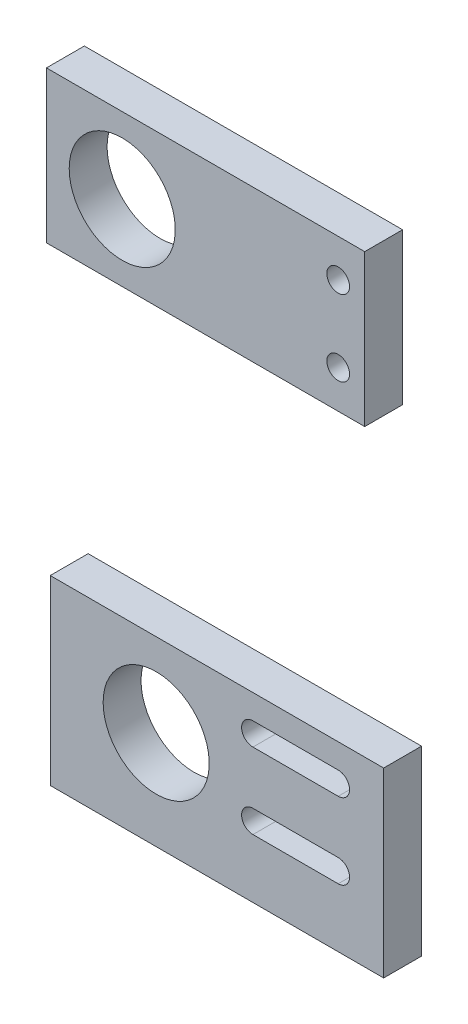
ISO-10303-21;
HEADER;
FILE_DESCRIPTION(('STEP AP214'),'2;1');
FILE_NAME('part.step','',(''),(''),'','','');
FILE_SCHEMA(('AUTOMOTIVE_DESIGN { 1 0 10303 214 1 1 1 1 }'));
ENDSEC;
DATA;
#1=APPLICATION_CONTEXT('core data for automotive mechanical design processes');
#2=APPLICATION_PROTOCOL_DEFINITION('international standard','automotive_design',2000,#1);
#3=PRODUCT_CONTEXT('',#1,'mechanical');
#4=PRODUCT('Part','Part','',(#3));
#5=PRODUCT_RELATED_PRODUCT_CATEGORY('part','',(#4));
#6=PRODUCT_DEFINITION_FORMATION('','',#4);
#7=PRODUCT_DEFINITION_CONTEXT('part definition',#1,'design');
#8=PRODUCT_DEFINITION('design','',#6,#7);
#9=PRODUCT_DEFINITION_SHAPE('','',#8);
#10=(LENGTH_UNIT() NAMED_UNIT(*) SI_UNIT(.MILLI.,.METRE.));
#11=(NAMED_UNIT(*) PLANE_ANGLE_UNIT() SI_UNIT($,.RADIAN.));
#12=(NAMED_UNIT(*) SI_UNIT($,.STERADIAN.) SOLID_ANGLE_UNIT());
#13=UNCERTAINTY_MEASURE_WITH_UNIT(LENGTH_MEASURE(1.E-05),#10,'distance_accuracy_value','');
#14=(GEOMETRIC_REPRESENTATION_CONTEXT(3) GLOBAL_UNCERTAINTY_ASSIGNED_CONTEXT((#13)) GLOBAL_UNIT_ASSIGNED_CONTEXT((#10,
#11,#12)) REPRESENTATION_CONTEXT('',''));
#15=CARTESIAN_POINT('',(0.,0.,0.));
#16=DIRECTION('',(0.,0.,1.));
#17=DIRECTION('',(1.,0.,0.));
#18=AXIS2_PLACEMENT_3D('',#15,#16,#17);
#19=CARTESIAN_POINT('',(3.5,0.,0.));
#20=DIRECTION('',(-1.,0.,0.));
#21=DIRECTION('',(0.,0.,1.));
#22=AXIS2_PLACEMENT_3D('',#19,#20,#21);
#23=PLANE('',#22);
#24=DIRECTION('',(0.,0.,-1.));
#25=VECTOR('',#24,1.);
#26=CARTESIAN_POINT('',(3.5,-10.,32.08));
#27=LINE('',#26,#25);
#28=CARTESIAN_POINT('',(3.5,-10.,32.08));
#29=VERTEX_POINT('',#28);
#30=CARTESIAN_POINT('',(3.5,-10.,27.08));
#31=VERTEX_POINT('',#30);
#32=EDGE_CURVE('E101',#29,#31,#27,.T.);
#33=ORIENTED_EDGE('',*,*,#32,.T.);
#34=DIRECTION('',(0.,1.,0.));
#35=VECTOR('',#34,1.);
#36=CARTESIAN_POINT('',(3.5,0.,27.08));
#37=LINE('',#36,#35);
#38=CARTESIAN_POINT('',(3.5,10.,27.08));
#39=VERTEX_POINT('',#38);
#40=EDGE_CURVE('E59',#31,#39,#37,.T.);
#41=ORIENTED_EDGE('',*,*,#40,.T.);
#42=DIRECTION('',(0.,0.,1.));
#43=VECTOR('',#42,1.);
#44=CARTESIAN_POINT('',(3.5,10.,32.08));
#45=LINE('',#44,#43);
#46=CARTESIAN_POINT('',(3.5,10.,32.08));
#47=VERTEX_POINT('',#46);
#48=EDGE_CURVE('E107',#39,#47,#45,.T.);
#49=ORIENTED_EDGE('',*,*,#48,.T.);
#50=DIRECTION('',(0.,-1.,0.));
#51=VECTOR('',#50,1.);
#52=CARTESIAN_POINT('',(3.5,10.,32.08));
#53=LINE('',#52,#51);
#54=EDGE_CURVE('E119',#47,#29,#53,.T.);
#55=ORIENTED_EDGE('',*,*,#54,.T.);
#56=EDGE_LOOP('',(#33,#41,#49,#55));
#57=FACE_BOUND('',#56,.T.);
#58=ADVANCED_FACE('F56',(#57),#23,.F.);
#59=CARTESIAN_POINT('',(-3.5,-10.,32.08));
#60=DIRECTION('',(0.,-1.,0.));
#61=DIRECTION('',(0.,0.,-1.));
#62=AXIS2_PLACEMENT_3D('',#59,#60,#61);
#63=PLANE('',#62);
#64=DIRECTION('',(1.,0.,0.));
#65=VECTOR('',#64,1.);
#66=CARTESIAN_POINT('',(-3.5,-10.,32.08));
#67=LINE('',#66,#65);
#68=CARTESIAN_POINT('',(-38.5,-10.,32.08));
#69=VERTEX_POINT('',#68);
#70=EDGE_CURVE('E96',#69,#29,#67,.T.);
#71=ORIENTED_EDGE('',*,*,#70,.F.);
#72=DIRECTION('',(0.,0.,1.));
#73=VECTOR('',#72,1.);
#74=CARTESIAN_POINT('',(-38.5,-10.,32.08));
#75=LINE('',#74,#73);
#76=CARTESIAN_POINT('',(-38.5,-10.,27.08));
#77=VERTEX_POINT('',#76);
#78=EDGE_CURVE('E99',#77,#69,#75,.T.);
#79=ORIENTED_EDGE('',*,*,#78,.F.);
#80=DIRECTION('',(1.,0.,0.));
#81=VECTOR('',#80,1.);
#82=CARTESIAN_POINT('',(-3.5,-10.,27.08));
#83=LINE('',#82,#81);
#84=EDGE_CURVE('E128',#77,#31,#83,.T.);
#85=ORIENTED_EDGE('',*,*,#84,.T.);
#86=ORIENTED_EDGE('',*,*,#32,.F.);
#87=EDGE_LOOP('',(#71,#79,#85,#86));
#88=FACE_BOUND('',#87,.T.);
#89=ADVANCED_FACE('F98',(#88),#63,.T.);
#90=CARTESIAN_POINT('',(-3.5,10.,32.08));
#91=DIRECTION('',(0.,1.,0.));
#92=DIRECTION('',(0.,0.,1.));
#93=AXIS2_PLACEMENT_3D('',#90,#91,#92);
#94=PLANE('',#93);
#95=ORIENTED_EDGE('',*,*,#48,.F.);
#96=DIRECTION('',(1.,0.,0.));
#97=VECTOR('',#96,1.);
#98=CARTESIAN_POINT('',(-38.5,10.,27.08));
#99=LINE('',#98,#97);
#100=CARTESIAN_POINT('',(-38.5,10.,27.08));
#101=VERTEX_POINT('',#100);
#102=EDGE_CURVE('E72',#101,#39,#99,.T.);
#103=ORIENTED_EDGE('',*,*,#102,.F.);
#104=DIRECTION('',(0.,0.,-1.));
#105=VECTOR('',#104,1.);
#106=CARTESIAN_POINT('',(-38.5,10.,32.08));
#107=LINE('',#106,#105);
#108=CARTESIAN_POINT('',(-38.5,10.,32.08));
#109=VERTEX_POINT('',#108);
#110=EDGE_CURVE('E120',#109,#101,#107,.T.);
#111=ORIENTED_EDGE('',*,*,#110,.F.);
#112=DIRECTION('',(1.,0.,0.));
#113=VECTOR('',#112,1.);
#114=CARTESIAN_POINT('',(-3.5,10.,32.08));
#115=LINE('',#114,#113);
#116=EDGE_CURVE('E106',#109,#47,#115,.T.);
#117=ORIENTED_EDGE('',*,*,#116,.T.);
#118=EDGE_LOOP('',(#95,#103,#111,#117));
#119=FACE_BOUND('',#118,.T.);
#120=ADVANCED_FACE('F146',(#119),#94,.T.);
#121=CARTESIAN_POINT('',(-3.5,10.,32.08));
#122=DIRECTION('',(0.,0.,1.));
#123=DIRECTION('',(1.,0.,0.));
#124=AXIS2_PLACEMENT_3D('',#121,#122,#123);
#125=PLANE('',#124);
#126=CARTESIAN_POINT('',(0.,5.,32.08));
#127=DIRECTION('',(0.,0.,1.));
#128=DIRECTION('',(1.,0.,0.));
#129=AXIS2_PLACEMENT_3D('',#126,#127,#128);
#130=CIRCLE('',#129,1.5);
#131=CARTESIAN_POINT('',(1.5,5.,32.08));
#132=VERTEX_POINT('',#131);
#133=EDGE_CURVE('E138',#132,#132,#130,.F.);
#134=ORIENTED_EDGE('',*,*,#133,.T.);
#135=EDGE_LOOP('',(#134));
#136=FACE_BOUND('',#135,.T.);
#137=CARTESIAN_POINT('',(0.,-5.,32.08));
#138=DIRECTION('',(0.,0.,1.));
#139=DIRECTION('',(1.,0.,0.));
#140=AXIS2_PLACEMENT_3D('',#137,#138,#139);
#141=CIRCLE('',#140,1.5);
#142=CARTESIAN_POINT('',(1.5,-5.,32.08));
#143=VERTEX_POINT('',#142);
#144=EDGE_CURVE('E135',#143,#143,#141,.F.);
#145=ORIENTED_EDGE('',*,*,#144,.T.);
#146=EDGE_LOOP('',(#145));
#147=FACE_BOUND('',#146,.T.);
#148=CARTESIAN_POINT('',(-28.5,0.,32.08));
#149=DIRECTION('',(0.,0.,-1.));
#150=DIRECTION('',(-1.,0.,0.));
#151=AXIS2_PLACEMENT_3D('',#148,#149,#150);
#152=CIRCLE('',#151,7.00000000000001);
#153=CARTESIAN_POINT('',(-35.5,0.,32.08));
#154=VERTEX_POINT('',#153);
#155=EDGE_CURVE('E134',#154,#154,#152,.T.);
#156=ORIENTED_EDGE('',*,*,#155,.T.);
#157=EDGE_LOOP('',(#156));
#158=FACE_BOUND('',#157,.T.);
#159=ORIENTED_EDGE('',*,*,#70,.T.);
#160=ORIENTED_EDGE('',*,*,#54,.F.);
#161=ORIENTED_EDGE('',*,*,#116,.F.);
#162=DIRECTION('',(0.,1.,0.));
#163=VECTOR('',#162,1.);
#164=CARTESIAN_POINT('',(-38.5,10.,32.08));
#165=LINE('',#164,#163);
#166=EDGE_CURVE('E113',#69,#109,#165,.T.);
#167=ORIENTED_EDGE('',*,*,#166,.F.);
#168=EDGE_LOOP('',(#159,#160,#161,#167));
#169=FACE_BOUND('',#168,.T.);
#170=ADVANCED_FACE('F116',(#136,#147,#158,#169),#125,.T.);
#171=CARTESIAN_POINT('',(0.,5.,39.58));
#172=DIRECTION('',(0.,0.,-1.));
#173=DIRECTION('',(-1.,0.,0.));
#174=AXIS2_PLACEMENT_3D('',#171,#172,#173);
#175=CYLINDRICAL_SURFACE('',#174,1.5);
#176=CARTESIAN_POINT('',(0.,5.,27.08));
#177=DIRECTION('',(0.,0.,1.));
#178=DIRECTION('',(1.,0.,0.));
#179=AXIS2_PLACEMENT_3D('',#176,#177,#178);
#180=CIRCLE('',#179,1.5);
#181=CARTESIAN_POINT('',(1.5,5.,27.08));
#182=VERTEX_POINT('',#181);
#183=EDGE_CURVE('E12',#182,#182,#180,.T.);
#184=ORIENTED_EDGE('',*,*,#183,.F.);
#185=EDGE_LOOP('',(#184));
#186=FACE_BOUND('',#185,.T.);
#187=ORIENTED_EDGE('',*,*,#133,.F.);
#188=EDGE_LOOP('',(#187));
#189=FACE_BOUND('',#188,.T.);
#190=ADVANCED_FACE('F174',(#186,#189),#175,.F.);
#191=CARTESIAN_POINT('',(0.,-5.,39.58));
#192=DIRECTION('',(0.,0.,-1.));
#193=DIRECTION('',(-1.,0.,0.));
#194=AXIS2_PLACEMENT_3D('',#191,#192,#193);
#195=CYLINDRICAL_SURFACE('',#194,1.5);
#196=CARTESIAN_POINT('',(0.,-5.,27.08));
#197=DIRECTION('',(0.,0.,1.));
#198=DIRECTION('',(1.,0.,0.));
#199=AXIS2_PLACEMENT_3D('',#196,#197,#198);
#200=CIRCLE('',#199,1.5);
#201=CARTESIAN_POINT('',(1.5,-5.,27.08));
#202=VERTEX_POINT('',#201);
#203=EDGE_CURVE('E64',#202,#202,#200,.T.);
#204=ORIENTED_EDGE('',*,*,#203,.F.);
#205=EDGE_LOOP('',(#204));
#206=FACE_BOUND('',#205,.T.);
#207=ORIENTED_EDGE('',*,*,#144,.F.);
#208=EDGE_LOOP('',(#207));
#209=FACE_BOUND('',#208,.T.);
#210=ADVANCED_FACE('F158',(#206,#209),#195,.F.);
#211=CARTESIAN_POINT('',(-28.5,0.,32.08));
#212=DIRECTION('',(0.,0.,-1.));
#213=DIRECTION('',(-1.,0.,0.));
#214=AXIS2_PLACEMENT_3D('',#211,#212,#213);
#215=CYLINDRICAL_SURFACE('',#214,7.00000000000001);
#216=ORIENTED_EDGE('',*,*,#155,.F.);
#217=EDGE_LOOP('',(#216));
#218=FACE_BOUND('',#217,.T.);
#219=CARTESIAN_POINT('',(-28.5,0.,27.08));
#220=DIRECTION('',(0.,0.,1.));
#221=DIRECTION('',(0.,-1.,0.));
#222=AXIS2_PLACEMENT_3D('',#219,#220,#221);
#223=CIRCLE('',#222,7.00000000000001);
#224=CARTESIAN_POINT('',(-28.5,-7.00000000000001,27.08));
#225=VERTEX_POINT('',#224);
#226=EDGE_CURVE('E131',#225,#225,#223,.T.);
#227=ORIENTED_EDGE('',*,*,#226,.F.);
#228=EDGE_LOOP('',(#227));
#229=FACE_BOUND('',#228,.T.);
#230=ADVANCED_FACE('F155',(#218,#229),#215,.F.);
#231=CARTESIAN_POINT('',(-38.5,0.,0.));
#232=DIRECTION('',(1.,0.,0.));
#233=DIRECTION('',(0.,0.,-1.));
#234=AXIS2_PLACEMENT_3D('',#231,#232,#233);
#235=PLANE('',#234);
#236=ORIENTED_EDGE('',*,*,#166,.T.);
#237=ORIENTED_EDGE('',*,*,#110,.T.);
#238=DIRECTION('',(0.,-1.,0.));
#239=VECTOR('',#238,1.);
#240=CARTESIAN_POINT('',(-38.5,10.,27.08));
#241=LINE('',#240,#239);
#242=EDGE_CURVE('E114',#101,#77,#241,.T.);
#243=ORIENTED_EDGE('',*,*,#242,.T.);
#244=ORIENTED_EDGE('',*,*,#78,.T.);
#245=EDGE_LOOP('',(#236,#237,#243,#244));
#246=FACE_BOUND('',#245,.T.);
#247=ADVANCED_FACE('F112',(#246),#235,.F.);
#248=CARTESIAN_POINT('',(-38.5,10.,27.08));
#249=DIRECTION('',(0.,0.,1.));
#250=DIRECTION('',(0.,-1.,0.));
#251=AXIS2_PLACEMENT_3D('',#248,#249,#250);
#252=PLANE('',#251);
#253=ORIENTED_EDGE('',*,*,#226,.T.);
#254=EDGE_LOOP('',(#253));
#255=FACE_BOUND('',#254,.T.);
#256=ORIENTED_EDGE('',*,*,#102,.T.);
#257=ORIENTED_EDGE('',*,*,#40,.F.);
#258=ORIENTED_EDGE('',*,*,#84,.F.);
#259=ORIENTED_EDGE('',*,*,#242,.F.);
#260=EDGE_LOOP('',(#256,#257,#258,#259));
#261=FACE_BOUND('',#260,.T.);
#262=ORIENTED_EDGE('',*,*,#183,.T.);
#263=EDGE_LOOP('',(#262));
#264=FACE_BOUND('',#263,.T.);
#265=ORIENTED_EDGE('',*,*,#203,.T.);
#266=EDGE_LOOP('',(#265));
#267=FACE_BOUND('',#266,.T.);
#268=ADVANCED_FACE('F148',(#255,#261,#264,#267),#252,.F.);
#269=CLOSED_SHELL('',(#58,#89,#120,#170,#190,#210,#230,#247,#268));
#270=MANIFOLD_SOLID_BREP('B2_NOT_SHOWN',#269);
#271=CARTESIAN_POINT('',(0.,-52.5,39.58));
#272=DIRECTION('',(0.,0.,-1.));
#273=DIRECTION('',(-1.,0.,0.));
#274=AXIS2_PLACEMENT_3D('',#271,#272,#273);
#275=CYLINDRICAL_SURFACE('',#274,1.5);
#276=CARTESIAN_POINT('',(0.,-52.5,32.08));
#277=DIRECTION('',(0.,0.,1.));
#278=DIRECTION('',(1.,0.,0.));
#279=AXIS2_PLACEMENT_3D('',#276,#277,#278);
#280=CIRCLE('',#279,1.5);
#281=CARTESIAN_POINT('',(0.,-51.,32.08));
#282=VERTEX_POINT('',#281);
#283=CARTESIAN_POINT('',(0.,-54.,32.08));
#284=VERTEX_POINT('',#283);
#285=EDGE_CURVE('E488',#282,#284,#280,.F.);
#286=ORIENTED_EDGE('',*,*,#285,.F.);
#287=DIRECTION('',(0.,0.,-1.));
#288=VECTOR('',#287,1.);
#289=CARTESIAN_POINT('',(0.,-51.,39.58));
#290=LINE('',#289,#288);
#291=CARTESIAN_POINT('',(0.,-51.,27.08));
#292=VERTEX_POINT('',#291);
#293=EDGE_CURVE('E471',#292,#282,#290,.F.);
#294=ORIENTED_EDGE('',*,*,#293,.F.);
#295=CARTESIAN_POINT('',(0.,-52.5,27.08));
#296=DIRECTION('',(0.,0.,1.));
#297=DIRECTION('',(1.,0.,0.));
#298=AXIS2_PLACEMENT_3D('',#295,#296,#297);
#299=CIRCLE('',#298,1.5);
#300=CARTESIAN_POINT('',(0.,-54.,27.08));
#301=VERTEX_POINT('',#300);
#302=EDGE_CURVE('E312',#301,#292,#299,.T.);
#303=ORIENTED_EDGE('',*,*,#302,.F.);
#304=DIRECTION('',(0.,0.,-1.));
#305=VECTOR('',#304,1.);
#306=CARTESIAN_POINT('',(0.,-54.,39.58));
#307=LINE('',#306,#305);
#308=EDGE_CURVE('E474',#301,#284,#307,.F.);
#309=ORIENTED_EDGE('',*,*,#308,.T.);
#310=EDGE_LOOP('',(#286,#294,#303,#309));
#311=FACE_BOUND('',#310,.T.);
#312=ADVANCED_FACE('F308',(#311),#275,.F.);
#313=CARTESIAN_POINT('',(0.,-62.5,39.58));
#314=DIRECTION('',(0.,0.,-1.));
#315=DIRECTION('',(-1.,0.,0.));
#316=AXIS2_PLACEMENT_3D('',#313,#314,#315);
#317=CYLINDRICAL_SURFACE('',#316,1.5);
#318=CARTESIAN_POINT('',(0.,-62.5,32.08));
#319=DIRECTION('',(0.,0.,1.));
#320=DIRECTION('',(1.,0.,0.));
#321=AXIS2_PLACEMENT_3D('',#318,#319,#320);
#322=CIRCLE('',#321,1.5);
#323=CARTESIAN_POINT('',(0.,-61.,32.08));
#324=VERTEX_POINT('',#323);
#325=CARTESIAN_POINT('',(0.,-64.,32.08));
#326=VERTEX_POINT('',#325);
#327=EDGE_CURVE('E493',#324,#326,#322,.F.);
#328=ORIENTED_EDGE('',*,*,#327,.F.);
#329=DIRECTION('',(0.,0.,-1.));
#330=VECTOR('',#329,1.);
#331=CARTESIAN_POINT('',(0.,-61.,39.58));
#332=LINE('',#331,#330);
#333=CARTESIAN_POINT('',(0.,-61.,27.08));
#334=VERTEX_POINT('',#333);
#335=EDGE_CURVE('E439',#334,#324,#332,.F.);
#336=ORIENTED_EDGE('',*,*,#335,.F.);
#337=CARTESIAN_POINT('',(0.,-62.5,27.08));
#338=DIRECTION('',(0.,0.,1.));
#339=DIRECTION('',(1.,0.,0.));
#340=AXIS2_PLACEMENT_3D('',#337,#338,#339);
#341=CIRCLE('',#340,1.5);
#342=CARTESIAN_POINT('',(0.,-64.,27.08));
#343=VERTEX_POINT('',#342);
#344=EDGE_CURVE('E501',#343,#334,#341,.T.);
#345=ORIENTED_EDGE('',*,*,#344,.F.);
#346=DIRECTION('',(0.,0.,-1.));
#347=VECTOR('',#346,1.);
#348=CARTESIAN_POINT('',(0.,-64.,39.58));
#349=LINE('',#348,#347);
#350=EDGE_CURVE('E436',#343,#326,#349,.F.);
#351=ORIENTED_EDGE('',*,*,#350,.T.);
#352=EDGE_LOOP('',(#328,#336,#345,#351));
#353=FACE_BOUND('',#352,.T.);
#354=ADVANCED_FACE('F575',(#353),#317,.F.);
#355=CARTESIAN_POINT('',(0.,0.,27.08));
#356=DIRECTION('',(0.,0.,1.));
#357=DIRECTION('',(1.,0.,0.));
#358=AXIS2_PLACEMENT_3D('',#355,#356,#357);
#359=PLANE('',#358);
#360=DIRECTION('',(-1.,0.,0.));
#361=VECTOR('',#360,1.);
#362=CARTESIAN_POINT('',(3.5,-47.77,27.08));
#363=LINE('',#362,#361);
#364=CARTESIAN_POINT('',(6.,-47.77,27.08));
#365=VERTEX_POINT('',#364);
#366=CARTESIAN_POINT('',(-38.,-47.77,27.08));
#367=VERTEX_POINT('',#366);
#368=EDGE_CURVE('E510',#365,#367,#363,.T.);
#369=ORIENTED_EDGE('',*,*,#368,.F.);
#370=DIRECTION('',(0.,1.,0.));
#371=VECTOR('',#370,1.);
#372=CARTESIAN_POINT('',(6.,-71.77,27.08));
#373=LINE('',#372,#371);
#374=CARTESIAN_POINT('',(6.,-71.77,27.08));
#375=VERTEX_POINT('',#374);
#376=EDGE_CURVE('E422',#375,#365,#373,.T.);
#377=ORIENTED_EDGE('',*,*,#376,.F.);
#378=DIRECTION('',(1.,0.,0.));
#379=VECTOR('',#378,1.);
#380=CARTESIAN_POINT('',(3.5,-71.77,27.08));
#381=LINE('',#380,#379);
#382=CARTESIAN_POINT('',(-38.,-71.77,27.08));
#383=VERTEX_POINT('',#382);
#384=EDGE_CURVE('E417',#383,#375,#381,.T.);
#385=ORIENTED_EDGE('',*,*,#384,.F.);
#386=DIRECTION('',(0.,-1.,0.));
#387=VECTOR('',#386,1.);
#388=CARTESIAN_POINT('',(-38.,-71.77,27.08));
#389=LINE('',#388,#387);
#390=EDGE_CURVE('E506',#367,#383,#389,.T.);
#391=ORIENTED_EDGE('',*,*,#390,.F.);
#392=EDGE_LOOP('',(#369,#377,#385,#391));
#393=FACE_BOUND('',#392,.T.);
#394=ORIENTED_EDGE('',*,*,#344,.T.);
#395=DIRECTION('',(1.,0.,0.));
#396=VECTOR('',#395,1.);
#397=CARTESIAN_POINT('',(-11.25,-61.,27.08));
#398=LINE('',#397,#396);
#399=CARTESIAN_POINT('',(-11.25,-61.,27.08));
#400=VERTEX_POINT('',#399);
#401=EDGE_CURVE('E334',#400,#334,#398,.T.);
#402=ORIENTED_EDGE('',*,*,#401,.F.);
#403=CARTESIAN_POINT('',(-11.25,-62.5,27.08));
#404=DIRECTION('',(0.,0.,1.));
#405=DIRECTION('',(1.,0.,0.));
#406=AXIS2_PLACEMENT_3D('',#403,#404,#405);
#407=CIRCLE('',#406,1.5);
#408=CARTESIAN_POINT('',(-11.25,-64.,27.08));
#409=VERTEX_POINT('',#408);
#410=EDGE_CURVE('E489',#409,#400,#407,.F.);
#411=ORIENTED_EDGE('',*,*,#410,.F.);
#412=DIRECTION('',(-1.,0.,0.));
#413=VECTOR('',#412,1.);
#414=CARTESIAN_POINT('',(-11.25,-64.,27.08));
#415=LINE('',#414,#413);
#416=EDGE_CURVE('E457',#343,#409,#415,.T.);
#417=ORIENTED_EDGE('',*,*,#416,.F.);
#418=EDGE_LOOP('',(#394,#402,#411,#417));
#419=FACE_BOUND('',#418,.T.);
#420=ORIENTED_EDGE('',*,*,#302,.T.);
#421=DIRECTION('',(1.,0.,0.));
#422=VECTOR('',#421,1.);
#423=CARTESIAN_POINT('',(-11.25,-51.,27.08));
#424=LINE('',#423,#422);
#425=CARTESIAN_POINT('',(-11.25,-51.,27.08));
#426=VERTEX_POINT('',#425);
#427=EDGE_CURVE('E468',#426,#292,#424,.T.);
#428=ORIENTED_EDGE('',*,*,#427,.F.);
#429=CARTESIAN_POINT('',(-11.25,-52.5,27.08));
#430=DIRECTION('',(0.,0.,1.));
#431=DIRECTION('',(1.,0.,0.));
#432=AXIS2_PLACEMENT_3D('',#429,#430,#431);
#433=CIRCLE('',#432,1.5);
#434=CARTESIAN_POINT('',(-11.25,-54.,27.08));
#435=VERTEX_POINT('',#434);
#436=EDGE_CURVE('E318',#435,#426,#433,.F.);
#437=ORIENTED_EDGE('',*,*,#436,.F.);
#438=DIRECTION('',(-1.,0.,0.));
#439=VECTOR('',#438,1.);
#440=CARTESIAN_POINT('',(-11.25,-54.,27.08));
#441=LINE('',#440,#439);
#442=EDGE_CURVE('E435',#301,#435,#441,.T.);
#443=ORIENTED_EDGE('',*,*,#442,.F.);
#444=EDGE_LOOP('',(#420,#428,#437,#443));
#445=FACE_BOUND('',#444,.T.);
#446=CARTESIAN_POINT('',(-24.02,-58.77,27.08));
#447=DIRECTION('',(0.,0.,1.));
#448=DIRECTION('',(1.,0.,0.));
#449=AXIS2_PLACEMENT_3D('',#446,#447,#448);
#450=CIRCLE('',#449,7.);
#451=CARTESIAN_POINT('',(-17.02,-58.77,27.08));
#452=VERTEX_POINT('',#451);
#453=EDGE_CURVE('E512',#452,#452,#450,.T.);
#454=ORIENTED_EDGE('',*,*,#453,.T.);
#455=EDGE_LOOP('',(#454));
#456=FACE_BOUND('',#455,.T.);
#457=ADVANCED_FACE('F310',(#393,#419,#445,#456),#359,.F.);
#458=CARTESIAN_POINT('',(3.5,-47.77,32.08));
#459=DIRECTION('',(0.,-1.,0.));
#460=DIRECTION('',(1.,0.,0.));
#461=AXIS2_PLACEMENT_3D('',#458,#459,#460);
#462=PLANE('',#461);
#463=DIRECTION('',(-1.,0.,0.));
#464=VECTOR('',#463,1.);
#465=CARTESIAN_POINT('',(3.5,-47.77,32.08));
#466=LINE('',#465,#464);
#467=CARTESIAN_POINT('',(6.,-47.77,32.08));
#468=VERTEX_POINT('',#467);
#469=CARTESIAN_POINT('',(-38.,-47.77,32.08));
#470=VERTEX_POINT('',#469);
#471=EDGE_CURVE('E507',#468,#470,#466,.T.);
#472=ORIENTED_EDGE('',*,*,#471,.F.);
#473=DIRECTION('',(0.,0.,1.));
#474=VECTOR('',#473,1.);
#475=CARTESIAN_POINT('',(6.,-47.77,32.08));
#476=LINE('',#475,#474);
#477=EDGE_CURVE('E427',#365,#468,#476,.T.);
#478=ORIENTED_EDGE('',*,*,#477,.F.);
#479=ORIENTED_EDGE('',*,*,#368,.T.);
#480=DIRECTION('',(0.,0.,-1.));
#481=VECTOR('',#480,1.);
#482=CARTESIAN_POINT('',(-38.,-47.77,32.08));
#483=LINE('',#482,#481);
#484=EDGE_CURVE('E497',#470,#367,#483,.T.);
#485=ORIENTED_EDGE('',*,*,#484,.F.);
#486=EDGE_LOOP('',(#472,#478,#479,#485));
#487=FACE_BOUND('',#486,.T.);
#488=ADVANCED_FACE('F560',(#487),#462,.F.);
#489=CARTESIAN_POINT('',(-38.,-71.77,32.08));
#490=DIRECTION('',(1.,0.,0.));
#491=DIRECTION('',(0.,0.,-1.));
#492=AXIS2_PLACEMENT_3D('',#489,#490,#491);
#493=PLANE('',#492);
#494=ORIENTED_EDGE('',*,*,#390,.T.);
#495=DIRECTION('',(0.,0.,-1.));
#496=VECTOR('',#495,1.);
#497=CARTESIAN_POINT('',(-38.,-71.77,32.08));
#498=LINE('',#497,#496);
#499=CARTESIAN_POINT('',(-38.,-71.77,32.08));
#500=VERTEX_POINT('',#499);
#501=EDGE_CURVE('E411',#500,#383,#498,.T.);
#502=ORIENTED_EDGE('',*,*,#501,.F.);
#503=DIRECTION('',(0.,-1.,0.));
#504=VECTOR('',#503,1.);
#505=CARTESIAN_POINT('',(-38.,-71.77,32.08));
#506=LINE('',#505,#504);
#507=EDGE_CURVE('E406',#470,#500,#506,.T.);
#508=ORIENTED_EDGE('',*,*,#507,.F.);
#509=ORIENTED_EDGE('',*,*,#484,.T.);
#510=EDGE_LOOP('',(#494,#502,#508,#509));
#511=FACE_BOUND('',#510,.T.);
#512=ADVANCED_FACE('F571',(#511),#493,.F.);
#513=CARTESIAN_POINT('',(0.,0.,32.08));
#514=DIRECTION('',(0.,0.,1.));
#515=DIRECTION('',(1.,0.,0.));
#516=AXIS2_PLACEMENT_3D('',#513,#514,#515);
#517=PLANE('',#516);
#518=DIRECTION('',(-1.,0.,0.));
#519=VECTOR('',#518,1.);
#520=CARTESIAN_POINT('',(-11.25,-61.,32.08));
#521=LINE('',#520,#519);
#522=CARTESIAN_POINT('',(-11.25,-61.,32.08));
#523=VERTEX_POINT('',#522);
#524=EDGE_CURVE('E454',#324,#523,#521,.T.);
#525=ORIENTED_EDGE('',*,*,#524,.F.);
#526=ORIENTED_EDGE('',*,*,#327,.T.);
#527=DIRECTION('',(1.,0.,0.));
#528=VECTOR('',#527,1.);
#529=CARTESIAN_POINT('',(-11.25,-64.,32.08));
#530=LINE('',#529,#528);
#531=CARTESIAN_POINT('',(-11.25,-64.,32.08));
#532=VERTEX_POINT('',#531);
#533=EDGE_CURVE('E326',#532,#326,#530,.T.);
#534=ORIENTED_EDGE('',*,*,#533,.F.);
#535=CARTESIAN_POINT('',(-11.25,-62.5,32.08));
#536=DIRECTION('',(0.,0.,1.));
#537=DIRECTION('',(1.,0.,0.));
#538=AXIS2_PLACEMENT_3D('',#535,#536,#537);
#539=CIRCLE('',#538,1.5);
#540=EDGE_CURVE('E484',#532,#523,#539,.F.);
#541=ORIENTED_EDGE('',*,*,#540,.T.);
#542=EDGE_LOOP('',(#525,#526,#534,#541));
#543=FACE_BOUND('',#542,.T.);
#544=DIRECTION('',(-1.,0.,0.));
#545=VECTOR('',#544,1.);
#546=CARTESIAN_POINT('',(-11.25,-51.,32.08));
#547=LINE('',#546,#545);
#548=CARTESIAN_POINT('',(-11.25,-51.,32.08));
#549=VERTEX_POINT('',#548);
#550=EDGE_CURVE('E462',#282,#549,#547,.T.);
#551=ORIENTED_EDGE('',*,*,#550,.F.);
#552=ORIENTED_EDGE('',*,*,#285,.T.);
#553=DIRECTION('',(1.,0.,0.));
#554=VECTOR('',#553,1.);
#555=CARTESIAN_POINT('',(-11.25,-54.,32.08));
#556=LINE('',#555,#554);
#557=CARTESIAN_POINT('',(-11.25,-54.,32.08));
#558=VERTEX_POINT('',#557);
#559=EDGE_CURVE('E465',#558,#284,#556,.T.);
#560=ORIENTED_EDGE('',*,*,#559,.F.);
#561=CARTESIAN_POINT('',(-11.25,-52.5,32.08));
#562=DIRECTION('',(0.,0.,1.));
#563=DIRECTION('',(1.,0.,0.));
#564=AXIS2_PLACEMENT_3D('',#561,#562,#563);
#565=CIRCLE('',#564,1.5);
#566=EDGE_CURVE('E54',#558,#549,#565,.F.);
#567=ORIENTED_EDGE('',*,*,#566,.T.);
#568=EDGE_LOOP('',(#551,#552,#560,#567));
#569=FACE_BOUND('',#568,.T.);
#570=CARTESIAN_POINT('',(-24.02,-58.77,32.08));
#571=DIRECTION('',(0.,0.,-1.));
#572=DIRECTION('',(-1.,0.,0.));
#573=AXIS2_PLACEMENT_3D('',#570,#571,#572);
#574=CIRCLE('',#573,7.);
#575=CARTESIAN_POINT('',(-31.02,-58.77,32.08));
#576=VERTEX_POINT('',#575);
#577=EDGE_CURVE('E521',#576,#576,#574,.T.);
#578=ORIENTED_EDGE('',*,*,#577,.T.);
#579=EDGE_LOOP('',(#578));
#580=FACE_BOUND('',#579,.T.);
#581=DIRECTION('',(1.,0.,0.));
#582=VECTOR('',#581,1.);
#583=CARTESIAN_POINT('',(3.5,-71.77,32.08));
#584=LINE('',#583,#582);
#585=CARTESIAN_POINT('',(6.,-71.77,32.08));
#586=VERTEX_POINT('',#585);
#587=EDGE_CURVE('E400',#500,#586,#584,.T.);
#588=ORIENTED_EDGE('',*,*,#587,.T.);
#589=DIRECTION('',(0.,-1.,0.));
#590=VECTOR('',#589,1.);
#591=CARTESIAN_POINT('',(6.,-71.77,32.08));
#592=LINE('',#591,#590);
#593=EDGE_CURVE('E404',#468,#586,#592,.T.);
#594=ORIENTED_EDGE('',*,*,#593,.F.);
#595=ORIENTED_EDGE('',*,*,#471,.T.);
#596=ORIENTED_EDGE('',*,*,#507,.T.);
#597=EDGE_LOOP('',(#588,#594,#595,#596));
#598=FACE_BOUND('',#597,.T.);
#599=ADVANCED_FACE('F402',(#543,#569,#580,#598),#517,.T.);
#600=CARTESIAN_POINT('',(-11.25,-62.5,39.58));
#601=DIRECTION('',(0.,0.,-1.));
#602=DIRECTION('',(-1.,0.,0.));
#603=AXIS2_PLACEMENT_3D('',#600,#601,#602);
#604=CYLINDRICAL_SURFACE('',#603,1.5);
#605=DIRECTION('',(0.,0.,-1.));
#606=VECTOR('',#605,1.);
#607=CARTESIAN_POINT('',(-11.25,-61.,39.58));
#608=LINE('',#607,#606);
#609=EDGE_CURVE('E446',#400,#523,#608,.F.);
#610=ORIENTED_EDGE('',*,*,#609,.T.);
#611=ORIENTED_EDGE('',*,*,#540,.F.);
#612=DIRECTION('',(0.,0.,-1.));
#613=VECTOR('',#612,1.);
#614=CARTESIAN_POINT('',(-11.25,-64.,39.58));
#615=LINE('',#614,#613);
#616=EDGE_CURVE('E443',#409,#532,#615,.F.);
#617=ORIENTED_EDGE('',*,*,#616,.F.);
#618=ORIENTED_EDGE('',*,*,#410,.T.);
#619=EDGE_LOOP('',(#610,#611,#617,#618));
#620=FACE_BOUND('',#619,.T.);
#621=ADVANCED_FACE('F586',(#620),#604,.F.);
#622=CARTESIAN_POINT('',(-11.25,-52.5,39.58));
#623=DIRECTION('',(0.,0.,-1.));
#624=DIRECTION('',(-1.,0.,0.));
#625=AXIS2_PLACEMENT_3D('',#622,#623,#624);
#626=CYLINDRICAL_SURFACE('',#625,1.5);
#627=DIRECTION('',(0.,0.,-1.));
#628=VECTOR('',#627,1.);
#629=CARTESIAN_POINT('',(-11.25,-51.,39.58));
#630=LINE('',#629,#628);
#631=EDGE_CURVE('E478',#426,#549,#630,.F.);
#632=ORIENTED_EDGE('',*,*,#631,.T.);
#633=ORIENTED_EDGE('',*,*,#566,.F.);
#634=DIRECTION('',(0.,0.,-1.));
#635=VECTOR('',#634,1.);
#636=CARTESIAN_POINT('',(-11.25,-54.,39.58));
#637=LINE('',#636,#635);
#638=EDGE_CURVE('E440',#435,#558,#637,.F.);
#639=ORIENTED_EDGE('',*,*,#638,.F.);
#640=ORIENTED_EDGE('',*,*,#436,.T.);
#641=EDGE_LOOP('',(#632,#633,#639,#640));
#642=FACE_BOUND('',#641,.T.);
#643=ADVANCED_FACE('F555',(#642),#626,.F.);
#644=CARTESIAN_POINT('',(-24.02,-58.77,32.08));
#645=DIRECTION('',(0.,0.,-1.));
#646=DIRECTION('',(-1.,0.,0.));
#647=AXIS2_PLACEMENT_3D('',#644,#645,#646);
#648=CYLINDRICAL_SURFACE('',#647,7.);
#649=ORIENTED_EDGE('',*,*,#577,.F.);
#650=EDGE_LOOP('',(#649));
#651=FACE_BOUND('',#650,.T.);
#652=ORIENTED_EDGE('',*,*,#453,.F.);
#653=EDGE_LOOP('',(#652));
#654=FACE_BOUND('',#653,.T.);
#655=ADVANCED_FACE('F567',(#651,#654),#648,.F.);
#656=CARTESIAN_POINT('',(3.5,-71.77,32.08));
#657=DIRECTION('',(0.,1.,0.));
#658=DIRECTION('',(-1.,0.,0.));
#659=AXIS2_PLACEMENT_3D('',#656,#657,#658);
#660=PLANE('',#659);
#661=ORIENTED_EDGE('',*,*,#384,.T.);
#662=DIRECTION('',(0.,0.,-1.));
#663=VECTOR('',#662,1.);
#664=CARTESIAN_POINT('',(6.,-71.77,32.08));
#665=LINE('',#664,#663);
#666=EDGE_CURVE('E414',#586,#375,#665,.T.);
#667=ORIENTED_EDGE('',*,*,#666,.F.);
#668=ORIENTED_EDGE('',*,*,#587,.F.);
#669=ORIENTED_EDGE('',*,*,#501,.T.);
#670=EDGE_LOOP('',(#661,#667,#668,#669));
#671=FACE_BOUND('',#670,.T.);
#672=ADVANCED_FACE('F415',(#671),#660,.F.);
#673=CARTESIAN_POINT('',(-11.25,-54.,27.079));
#674=DIRECTION('',(0.,-1.,0.));
#675=DIRECTION('',(0.,0.,-1.));
#676=AXIS2_PLACEMENT_3D('',#673,#674,#675);
#677=PLANE('',#676);
#678=ORIENTED_EDGE('',*,*,#442,.T.);
#679=ORIENTED_EDGE('',*,*,#638,.T.);
#680=ORIENTED_EDGE('',*,*,#559,.T.);
#681=ORIENTED_EDGE('',*,*,#308,.F.);
#682=EDGE_LOOP('',(#678,#679,#680,#681));
#683=FACE_BOUND('',#682,.T.);
#684=ADVANCED_FACE('F557',(#683),#677,.F.);
#685=CARTESIAN_POINT('',(-11.25,-51.,27.079));
#686=DIRECTION('',(0.,1.,0.));
#687=DIRECTION('',(0.,0.,1.));
#688=AXIS2_PLACEMENT_3D('',#685,#686,#687);
#689=PLANE('',#688);
#690=ORIENTED_EDGE('',*,*,#427,.T.);
#691=ORIENTED_EDGE('',*,*,#293,.T.);
#692=ORIENTED_EDGE('',*,*,#550,.T.);
#693=ORIENTED_EDGE('',*,*,#631,.F.);
#694=EDGE_LOOP('',(#690,#691,#692,#693));
#695=FACE_BOUND('',#694,.T.);
#696=ADVANCED_FACE('F548',(#695),#689,.F.);
#697=CARTESIAN_POINT('',(-11.25,-64.,27.079));
#698=DIRECTION('',(0.,-1.,0.));
#699=DIRECTION('',(0.,0.,-1.));
#700=AXIS2_PLACEMENT_3D('',#697,#698,#699);
#701=PLANE('',#700);
#702=ORIENTED_EDGE('',*,*,#416,.T.);
#703=ORIENTED_EDGE('',*,*,#616,.T.);
#704=ORIENTED_EDGE('',*,*,#533,.T.);
#705=ORIENTED_EDGE('',*,*,#350,.F.);
#706=EDGE_LOOP('',(#702,#703,#704,#705));
#707=FACE_BOUND('',#706,.T.);
#708=ADVANCED_FACE('F565',(#707),#701,.F.);
#709=CARTESIAN_POINT('',(-11.25,-61.,27.079));
#710=DIRECTION('',(0.,1.,0.));
#711=DIRECTION('',(0.,0.,1.));
#712=AXIS2_PLACEMENT_3D('',#709,#710,#711);
#713=PLANE('',#712);
#714=ORIENTED_EDGE('',*,*,#401,.T.);
#715=ORIENTED_EDGE('',*,*,#335,.T.);
#716=ORIENTED_EDGE('',*,*,#524,.T.);
#717=ORIENTED_EDGE('',*,*,#609,.F.);
#718=EDGE_LOOP('',(#714,#715,#716,#717));
#719=FACE_BOUND('',#718,.T.);
#720=ADVANCED_FACE('F663',(#719),#713,.F.);
#721=CARTESIAN_POINT('',(6.,0.,0.));
#722=DIRECTION('',(-1.,0.,0.));
#723=DIRECTION('',(0.,0.,1.));
#724=AXIS2_PLACEMENT_3D('',#721,#722,#723);
#725=PLANE('',#724);
#726=ORIENTED_EDGE('',*,*,#593,.T.);
#727=ORIENTED_EDGE('',*,*,#666,.T.);
#728=ORIENTED_EDGE('',*,*,#376,.T.);
#729=ORIENTED_EDGE('',*,*,#477,.T.);
#730=EDGE_LOOP('',(#726,#727,#728,#729));
#731=FACE_BOUND('',#730,.T.);
#732=ADVANCED_FACE('F425',(#731),#725,.F.);
#733=CLOSED_SHELL('',(#312,#354,#457,#488,#512,#599,#621,#643,#655,#672,#684,#696,#708,#720,#732));
#734=MANIFOLD_SOLID_BREP('B6',#733);
#735=ADVANCED_BREP_SHAPE_REPRESENTATION('',(#18,#270,#734),#14);
#736=SHAPE_DEFINITION_REPRESENTATION(#9,#735);
ENDSEC;
END-ISO-10303-21;
